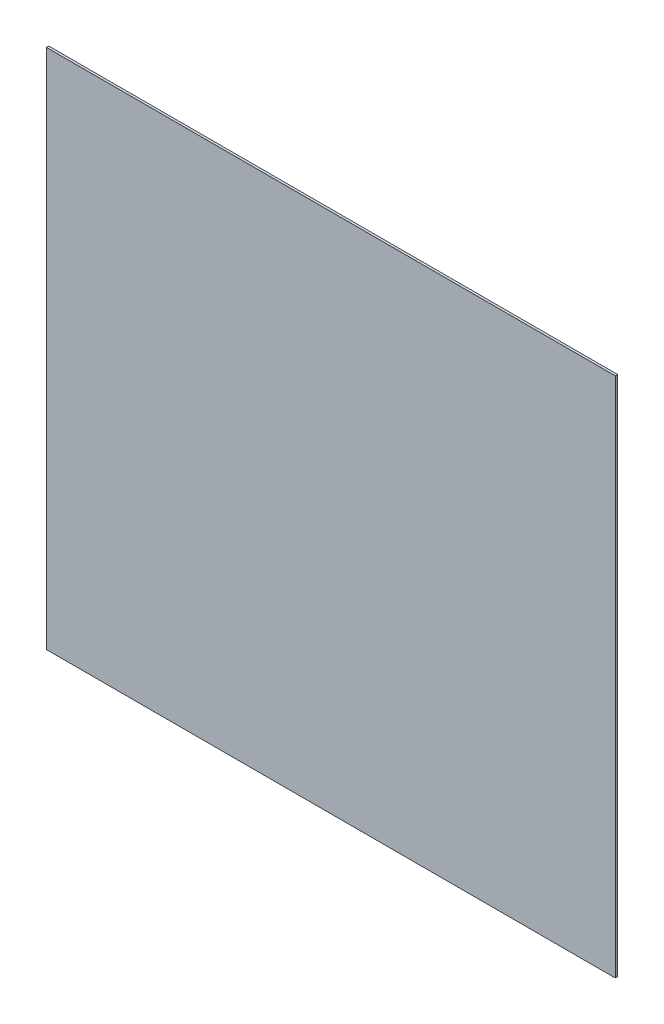
ISO-10303-21;
HEADER;
FILE_DESCRIPTION(('STEP AP214'),'2;1');
FILE_NAME('part.step','',(''),(''),'','','');
FILE_SCHEMA(('AUTOMOTIVE_DESIGN { 1 0 10303 214 1 1 1 1 }'));
ENDSEC;
DATA;
#1=APPLICATION_CONTEXT('core data for automotive mechanical design processes');
#2=APPLICATION_PROTOCOL_DEFINITION('international standard','automotive_design',2000,#1);
#3=PRODUCT_CONTEXT('',#1,'mechanical');
#4=PRODUCT('Part','Part','',(#3));
#5=PRODUCT_RELATED_PRODUCT_CATEGORY('part','',(#4));
#6=PRODUCT_DEFINITION_FORMATION('','',#4);
#7=PRODUCT_DEFINITION_CONTEXT('part definition',#1,'design');
#8=PRODUCT_DEFINITION('design','',#6,#7);
#9=PRODUCT_DEFINITION_SHAPE('','',#8);
#10=(LENGTH_UNIT() NAMED_UNIT(*) SI_UNIT(.MILLI.,.METRE.));
#11=(NAMED_UNIT(*) PLANE_ANGLE_UNIT() SI_UNIT($,.RADIAN.));
#12=(NAMED_UNIT(*) SI_UNIT($,.STERADIAN.) SOLID_ANGLE_UNIT());
#13=UNCERTAINTY_MEASURE_WITH_UNIT(LENGTH_MEASURE(1.E-05),#10,'distance_accuracy_value','');
#14=(GEOMETRIC_REPRESENTATION_CONTEXT(3) GLOBAL_UNCERTAINTY_ASSIGNED_CONTEXT((#13)) GLOBAL_UNIT_ASSIGNED_CONTEXT((#10,
#11,#12)) REPRESENTATION_CONTEXT('',''));
#15=CARTESIAN_POINT('',(0.,0.,0.));
#16=DIRECTION('',(0.,0.,1.));
#17=DIRECTION('',(1.,0.,0.));
#18=AXIS2_PLACEMENT_3D('',#15,#16,#17);
#19=CARTESIAN_POINT('',(0.,0.,0.2));
#20=DIRECTION('',(1.,0.,0.));
#21=DIRECTION('',(0.,0.,-1.));
#22=AXIS2_PLACEMENT_3D('',#19,#20,#21);
#23=PLANE('',#22);
#24=DIRECTION('',(0.,-1.,0.));
#25=VECTOR('',#24,1.);
#26=CARTESIAN_POINT('',(0.,0.,0.));
#27=LINE('',#26,#25);
#28=CARTESIAN_POINT('',(0.,44.,0.));
#29=VERTEX_POINT('',#28);
#30=CARTESIAN_POINT('',(0.,0.,0.));
#31=VERTEX_POINT('',#30);
#32=EDGE_CURVE('E107',#29,#31,#27,.T.);
#33=ORIENTED_EDGE('',*,*,#32,.T.);
#34=DIRECTION('',(0.,0.,-1.));
#35=VECTOR('',#34,1.);
#36=CARTESIAN_POINT('',(0.,0.,0.2));
#37=LINE('',#36,#35);
#38=CARTESIAN_POINT('',(0.,0.,0.2));
#39=VERTEX_POINT('',#38);
#40=EDGE_CURVE('E11',#39,#31,#37,.T.);
#41=ORIENTED_EDGE('',*,*,#40,.F.);
#42=DIRECTION('',(0.,-1.,0.));
#43=VECTOR('',#42,1.);
#44=CARTESIAN_POINT('',(0.,0.,0.2));
#45=LINE('',#44,#43);
#46=CARTESIAN_POINT('',(0.,44.,0.2));
#47=VERTEX_POINT('',#46);
#48=EDGE_CURVE('E91',#47,#39,#45,.T.);
#49=ORIENTED_EDGE('',*,*,#48,.F.);
#50=DIRECTION('',(0.,0.,-1.));
#51=VECTOR('',#50,1.);
#52=CARTESIAN_POINT('',(0.,44.,0.2));
#53=LINE('',#52,#51);
#54=EDGE_CURVE('E103',#47,#29,#53,.T.);
#55=ORIENTED_EDGE('',*,*,#54,.T.);
#56=EDGE_LOOP('',(#33,#41,#49,#55));
#57=FACE_BOUND('',#56,.T.);
#58=ADVANCED_FACE('F39',(#57),#23,.F.);
#59=CARTESIAN_POINT('',(0.,0.,0.2));
#60=DIRECTION('',(0.,1.,0.));
#61=DIRECTION('',(0.,0.,1.));
#62=AXIS2_PLACEMENT_3D('',#59,#60,#61);
#63=PLANE('',#62);
#64=DIRECTION('',(1.,0.,0.));
#65=VECTOR('',#64,1.);
#66=CARTESIAN_POINT('',(0.,0.,0.));
#67=LINE('',#66,#65);
#68=CARTESIAN_POINT('',(48.,0.,0.));
#69=VERTEX_POINT('',#68);
#70=EDGE_CURVE('E96',#31,#69,#67,.T.);
#71=ORIENTED_EDGE('',*,*,#70,.T.);
#72=DIRECTION('',(0.,0.,-1.));
#73=VECTOR('',#72,1.);
#74=CARTESIAN_POINT('',(48.,0.,0.2));
#75=LINE('',#74,#73);
#76=CARTESIAN_POINT('',(48.,0.,0.2));
#77=VERTEX_POINT('',#76);
#78=EDGE_CURVE('E48',#77,#69,#75,.T.);
#79=ORIENTED_EDGE('',*,*,#78,.F.);
#80=DIRECTION('',(1.,0.,0.));
#81=VECTOR('',#80,1.);
#82=CARTESIAN_POINT('',(0.,0.,0.2));
#83=LINE('',#82,#81);
#84=EDGE_CURVE('E86',#39,#77,#83,.T.);
#85=ORIENTED_EDGE('',*,*,#84,.F.);
#86=ORIENTED_EDGE('',*,*,#40,.T.);
#87=EDGE_LOOP('',(#71,#79,#85,#86));
#88=FACE_BOUND('',#87,.T.);
#89=ADVANCED_FACE('F95',(#88),#63,.F.);
#90=CARTESIAN_POINT('',(48.,0.,0.2));
#91=DIRECTION('',(-1.,0.,0.));
#92=DIRECTION('',(0.,0.,1.));
#93=AXIS2_PLACEMENT_3D('',#90,#91,#92);
#94=PLANE('',#93);
#95=DIRECTION('',(0.,1.,0.));
#96=VECTOR('',#95,1.);
#97=CARTESIAN_POINT('',(48.,0.,0.));
#98=LINE('',#97,#96);
#99=CARTESIAN_POINT('',(48.,44.,0.));
#100=VERTEX_POINT('',#99);
#101=EDGE_CURVE('E73',#69,#100,#98,.T.);
#102=ORIENTED_EDGE('',*,*,#101,.T.);
#103=DIRECTION('',(0.,0.,-1.));
#104=VECTOR('',#103,1.);
#105=CARTESIAN_POINT('',(48.,44.,0.2));
#106=LINE('',#105,#104);
#107=CARTESIAN_POINT('',(48.,44.,0.2));
#108=VERTEX_POINT('',#107);
#109=EDGE_CURVE('E98',#108,#100,#106,.T.);
#110=ORIENTED_EDGE('',*,*,#109,.F.);
#111=DIRECTION('',(0.,1.,0.));
#112=VECTOR('',#111,1.);
#113=CARTESIAN_POINT('',(48.,0.,0.2));
#114=LINE('',#113,#112);
#115=EDGE_CURVE('E89',#77,#108,#114,.T.);
#116=ORIENTED_EDGE('',*,*,#115,.F.);
#117=ORIENTED_EDGE('',*,*,#78,.T.);
#118=EDGE_LOOP('',(#102,#110,#116,#117));
#119=FACE_BOUND('',#118,.T.);
#120=ADVANCED_FACE('F99',(#119),#94,.F.);
#121=CARTESIAN_POINT('',(0.,44.,0.2));
#122=DIRECTION('',(0.,-1.,0.));
#123=DIRECTION('',(0.,0.,-1.));
#124=AXIS2_PLACEMENT_3D('',#121,#122,#123);
#125=PLANE('',#124);
#126=DIRECTION('',(-1.,0.,0.));
#127=VECTOR('',#126,1.);
#128=CARTESIAN_POINT('',(0.,44.,0.));
#129=LINE('',#128,#127);
#130=EDGE_CURVE('E79',#100,#29,#129,.T.);
#131=ORIENTED_EDGE('',*,*,#130,.T.);
#132=ORIENTED_EDGE('',*,*,#54,.F.);
#133=DIRECTION('',(-1.,0.,0.));
#134=VECTOR('',#133,1.);
#135=CARTESIAN_POINT('',(0.,44.,0.2));
#136=LINE('',#135,#134);
#137=EDGE_CURVE('E56',#108,#47,#136,.T.);
#138=ORIENTED_EDGE('',*,*,#137,.F.);
#139=ORIENTED_EDGE('',*,*,#109,.T.);
#140=EDGE_LOOP('',(#131,#132,#138,#139));
#141=FACE_BOUND('',#140,.T.);
#142=ADVANCED_FACE('F120',(#141),#125,.F.);
#143=CARTESIAN_POINT('',(0.,0.,0.2));
#144=DIRECTION('',(0.,0.,-1.));
#145=DIRECTION('',(-1.,0.,0.));
#146=AXIS2_PLACEMENT_3D('',#143,#144,#145);
#147=PLANE('',#146);
#148=ORIENTED_EDGE('',*,*,#48,.T.);
#149=ORIENTED_EDGE('',*,*,#84,.T.);
#150=ORIENTED_EDGE('',*,*,#115,.T.);
#151=ORIENTED_EDGE('',*,*,#137,.T.);
#152=EDGE_LOOP('',(#148,#149,#150,#151));
#153=FACE_BOUND('',#152,.T.);
#154=ADVANCED_FACE('F87',(#153),#147,.F.);
#155=CARTESIAN_POINT('',(0.,0.,0.));
#156=DIRECTION('',(0.,0.,-1.));
#157=DIRECTION('',(-1.,0.,0.));
#158=AXIS2_PLACEMENT_3D('',#155,#156,#157);
#159=PLANE('',#158);
#160=ORIENTED_EDGE('',*,*,#32,.F.);
#161=ORIENTED_EDGE('',*,*,#130,.F.);
#162=ORIENTED_EDGE('',*,*,#101,.F.);
#163=ORIENTED_EDGE('',*,*,#70,.F.);
#164=EDGE_LOOP('',(#160,#161,#162,#163));
#165=FACE_BOUND('',#164,.T.);
#166=ADVANCED_FACE('F123',(#165),#159,.T.);
#167=CLOSED_SHELL('',(#58,#89,#120,#142,#154,#166));
#168=MANIFOLD_SOLID_BREP('B2',#167);
#169=ADVANCED_BREP_SHAPE_REPRESENTATION('',(#18,#168),#14);
#170=SHAPE_DEFINITION_REPRESENTATION(#9,#169);
ENDSEC;
END-ISO-10303-21;
